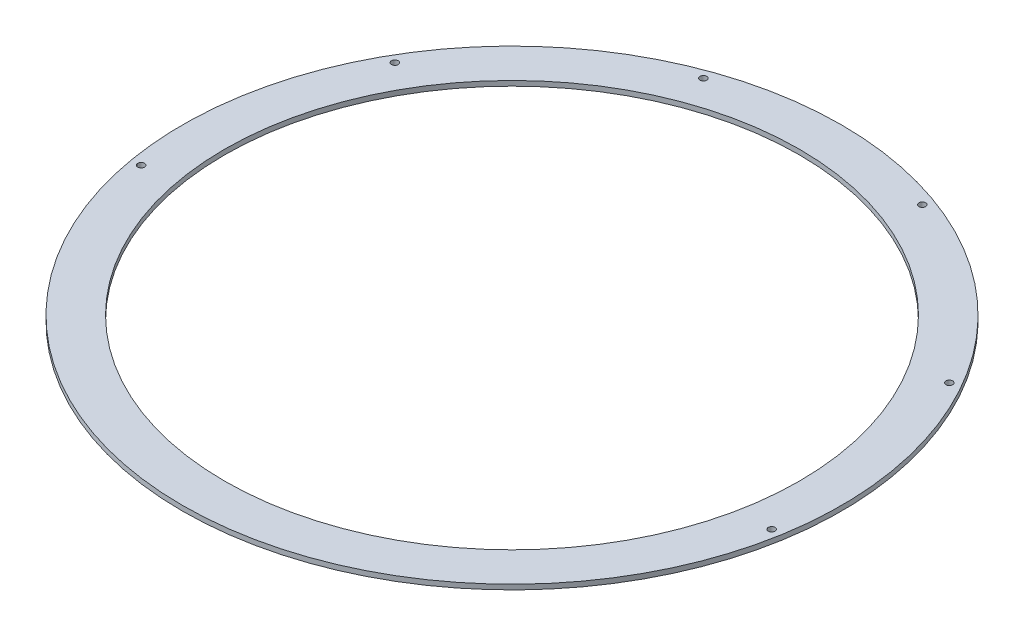
ISO-10303-21;
HEADER;
FILE_DESCRIPTION(('STEP AP214'),'2;1');
FILE_NAME('part.step','',(''),(''),'','','');
FILE_SCHEMA(('AUTOMOTIVE_DESIGN { 1 0 10303 214 1 1 1 1 }'));
ENDSEC;
DATA;
#1=APPLICATION_CONTEXT('core data for automotive mechanical design processes');
#2=APPLICATION_PROTOCOL_DEFINITION('international standard','automotive_design',2000,#1);
#3=PRODUCT_CONTEXT('',#1,'mechanical');
#4=PRODUCT('Part','Part','',(#3));
#5=PRODUCT_RELATED_PRODUCT_CATEGORY('part','',(#4));
#6=PRODUCT_DEFINITION_FORMATION('','',#4);
#7=PRODUCT_DEFINITION_CONTEXT('part definition',#1,'design');
#8=PRODUCT_DEFINITION('design','',#6,#7);
#9=PRODUCT_DEFINITION_SHAPE('','',#8);
#10=(LENGTH_UNIT() NAMED_UNIT(*) SI_UNIT(.MILLI.,.METRE.));
#11=(NAMED_UNIT(*) PLANE_ANGLE_UNIT() SI_UNIT($,.RADIAN.));
#12=(NAMED_UNIT(*) SI_UNIT($,.STERADIAN.) SOLID_ANGLE_UNIT());
#13=UNCERTAINTY_MEASURE_WITH_UNIT(LENGTH_MEASURE(1.E-05),#10,'distance_accuracy_value','');
#14=(GEOMETRIC_REPRESENTATION_CONTEXT(3) GLOBAL_UNCERTAINTY_ASSIGNED_CONTEXT((#13)) GLOBAL_UNIT_ASSIGNED_CONTEXT((#10,
#11,#12)) REPRESENTATION_CONTEXT('',''));
#15=CARTESIAN_POINT('',(0.,0.,0.));
#16=DIRECTION('',(0.,0.,1.));
#17=DIRECTION('',(1.,0.,0.));
#18=AXIS2_PLACEMENT_3D('',#15,#16,#17);
#19=CARTESIAN_POINT('',(0.,5.,0.));
#20=DIRECTION('',(0.,1.,0.));
#21=DIRECTION('',(0.,0.,1.));
#22=AXIS2_PLACEMENT_3D('',#19,#20,#21);
#23=PLANE('',#22);
#24=CARTESIAN_POINT('',(-318.092904222944,5.,56.088361386413));
#25=DIRECTION('',(0.,1.,0.));
#26=DIRECTION('',(0.,0.,1.));
#27=AXIS2_PLACEMENT_3D('',#24,#25,#26);
#28=CIRCLE('',#27,3.40000000000001);
#29=CARTESIAN_POINT('',(-318.092904222944,5.,59.488361386413));
#30=VERTEX_POINT('',#29);
#31=EDGE_CURVE('E88',#30,#30,#28,.T.);
#32=ORIENTED_EDGE('',*,*,#31,.F.);
#33=EDGE_LOOP('',(#32));
#34=FACE_BOUND('',#33,.T.);
#35=CARTESIAN_POINT('',(-279.726205422372,5.,-161.500000000003));
#36=DIRECTION('',(0.,1.,0.));
#37=DIRECTION('',(0.,0.,1.));
#38=AXIS2_PLACEMENT_3D('',#35,#36,#37);
#39=CIRCLE('',#38,3.40000000000001);
#40=CARTESIAN_POINT('',(-279.726205422372,5.,-158.100000000003));
#41=VERTEX_POINT('',#40);
#42=EDGE_CURVE('E82',#41,#41,#39,.T.);
#43=ORIENTED_EDGE('',*,*,#42,.F.);
#44=EDGE_LOOP('',(#43));
#45=FACE_BOUND('',#44,.T.);
#46=CARTESIAN_POINT('',(-110.472506294189,5.,-303.520716513849));
#47=DIRECTION('',(0.,1.,0.));
#48=DIRECTION('',(0.,0.,1.));
#49=AXIS2_PLACEMENT_3D('',#46,#47,#48);
#50=CIRCLE('',#49,3.39999999999999);
#51=CARTESIAN_POINT('',(-110.472506294189,5.,-300.120716513849));
#52=VERTEX_POINT('',#51);
#53=EDGE_CURVE('E76',#52,#52,#50,.T.);
#54=ORIENTED_EDGE('',*,*,#53,.F.);
#55=EDGE_LOOP('',(#54));
#56=FACE_BOUND('',#55,.T.);
#57=CARTESIAN_POINT('',(110.472506294189,5.,-303.520716513849));
#58=DIRECTION('',(0.,1.,0.));
#59=DIRECTION('',(0.,0.,1.));
#60=AXIS2_PLACEMENT_3D('',#57,#58,#59);
#61=CIRCLE('',#60,3.39999999999999);
#62=CARTESIAN_POINT('',(110.472506294189,5.,-300.120716513849));
#63=VERTEX_POINT('',#62);
#64=EDGE_CURVE('E70',#63,#63,#61,.T.);
#65=ORIENTED_EDGE('',*,*,#64,.F.);
#66=EDGE_LOOP('',(#65));
#67=FACE_BOUND('',#66,.T.);
#68=CARTESIAN_POINT('',(279.726205422372,5.,-161.500000000003));
#69=DIRECTION('',(0.,1.,0.));
#70=DIRECTION('',(0.,0.,1.));
#71=AXIS2_PLACEMENT_3D('',#68,#69,#70);
#72=CIRCLE('',#71,3.40000000000001);
#73=CARTESIAN_POINT('',(279.726205422372,5.,-158.100000000003));
#74=VERTEX_POINT('',#73);
#75=EDGE_CURVE('E64',#74,#74,#72,.T.);
#76=ORIENTED_EDGE('',*,*,#75,.F.);
#77=EDGE_LOOP('',(#76));
#78=FACE_BOUND('',#77,.T.);
#79=CARTESIAN_POINT('',(318.092904222944,5.,56.088361386413));
#80=DIRECTION('',(0.,1.,0.));
#81=DIRECTION('',(0.,0.,1.));
#82=AXIS2_PLACEMENT_3D('',#79,#80,#81);
#83=CIRCLE('',#82,3.40000000000001);
#84=CARTESIAN_POINT('',(318.092904222944,5.,59.488361386413));
#85=VERTEX_POINT('',#84);
#86=EDGE_CURVE('E58',#85,#85,#83,.T.);
#87=ORIENTED_EDGE('',*,*,#86,.F.);
#88=EDGE_LOOP('',(#87));
#89=FACE_BOUND('',#88,.T.);
#90=CARTESIAN_POINT('',(0.,5.,0.));
#91=DIRECTION('',(0.,1.,0.));
#92=DIRECTION('',(0.,0.,1.));
#93=AXIS2_PLACEMENT_3D('',#90,#91,#92);
#94=CIRCLE('',#93,332.5);
#95=CARTESIAN_POINT('',(0.,5.,332.5));
#96=VERTEX_POINT('',#95);
#97=EDGE_CURVE('E10',#96,#96,#94,.T.);
#98=ORIENTED_EDGE('',*,*,#97,.T.);
#99=EDGE_LOOP('',(#98));
#100=FACE_BOUND('',#99,.T.);
#101=CARTESIAN_POINT('',(0.,5.,0.));
#102=DIRECTION('',(0.,1.,0.));
#103=DIRECTION('',(0.,0.,1.));
#104=AXIS2_PLACEMENT_3D('',#101,#102,#103);
#105=CIRCLE('',#104,290.);
#106=CARTESIAN_POINT('',(0.,5.,290.));
#107=VERTEX_POINT('',#106);
#108=EDGE_CURVE('E48',#107,#107,#105,.T.);
#109=ORIENTED_EDGE('',*,*,#108,.F.);
#110=EDGE_LOOP('',(#109));
#111=FACE_BOUND('',#110,.T.);
#112=ADVANCED_FACE('F37',(#34,#45,#56,#67,#78,#89,#100,#111),#23,.T.);
#113=CARTESIAN_POINT('',(0.,0.,0.));
#114=DIRECTION('',(0.,1.,0.));
#115=DIRECTION('',(0.,0.,1.));
#116=AXIS2_PLACEMENT_3D('',#113,#114,#115);
#117=PLANE('',#116);
#118=CARTESIAN_POINT('',(-318.092904222944,0.,56.088361386413));
#119=DIRECTION('',(0.,1.,0.));
#120=DIRECTION('',(0.,0.,1.));
#121=AXIS2_PLACEMENT_3D('',#118,#119,#120);
#122=CIRCLE('',#121,3.40000000000001);
#123=CARTESIAN_POINT('',(-318.092904222944,0.,59.488361386413));
#124=VERTEX_POINT('',#123);
#125=EDGE_CURVE('E85',#124,#124,#122,.T.);
#126=ORIENTED_EDGE('',*,*,#125,.T.);
#127=EDGE_LOOP('',(#126));
#128=FACE_BOUND('',#127,.T.);
#129=CARTESIAN_POINT('',(-279.726205422372,0.,-161.500000000003));
#130=DIRECTION('',(0.,1.,0.));
#131=DIRECTION('',(0.,0.,1.));
#132=AXIS2_PLACEMENT_3D('',#129,#130,#131);
#133=CIRCLE('',#132,3.40000000000001);
#134=CARTESIAN_POINT('',(-279.726205422372,0.,-158.100000000003));
#135=VERTEX_POINT('',#134);
#136=EDGE_CURVE('E79',#135,#135,#133,.T.);
#137=ORIENTED_EDGE('',*,*,#136,.T.);
#138=EDGE_LOOP('',(#137));
#139=FACE_BOUND('',#138,.T.);
#140=CARTESIAN_POINT('',(-110.472506294189,0.,-303.520716513849));
#141=DIRECTION('',(0.,1.,0.));
#142=DIRECTION('',(0.,0.,1.));
#143=AXIS2_PLACEMENT_3D('',#140,#141,#142);
#144=CIRCLE('',#143,3.39999999999999);
#145=CARTESIAN_POINT('',(-110.472506294189,0.,-300.120716513849));
#146=VERTEX_POINT('',#145);
#147=EDGE_CURVE('E73',#146,#146,#144,.T.);
#148=ORIENTED_EDGE('',*,*,#147,.T.);
#149=EDGE_LOOP('',(#148));
#150=FACE_BOUND('',#149,.T.);
#151=CARTESIAN_POINT('',(110.472506294189,0.,-303.520716513849));
#152=DIRECTION('',(0.,1.,0.));
#153=DIRECTION('',(0.,0.,1.));
#154=AXIS2_PLACEMENT_3D('',#151,#152,#153);
#155=CIRCLE('',#154,3.39999999999999);
#156=CARTESIAN_POINT('',(110.472506294189,0.,-300.120716513849));
#157=VERTEX_POINT('',#156);
#158=EDGE_CURVE('E67',#157,#157,#155,.T.);
#159=ORIENTED_EDGE('',*,*,#158,.T.);
#160=EDGE_LOOP('',(#159));
#161=FACE_BOUND('',#160,.T.);
#162=CARTESIAN_POINT('',(279.726205422372,0.,-161.500000000003));
#163=DIRECTION('',(0.,1.,0.));
#164=DIRECTION('',(0.,0.,1.));
#165=AXIS2_PLACEMENT_3D('',#162,#163,#164);
#166=CIRCLE('',#165,3.40000000000001);
#167=CARTESIAN_POINT('',(279.726205422372,0.,-158.100000000003));
#168=VERTEX_POINT('',#167);
#169=EDGE_CURVE('E61',#168,#168,#166,.T.);
#170=ORIENTED_EDGE('',*,*,#169,.T.);
#171=EDGE_LOOP('',(#170));
#172=FACE_BOUND('',#171,.T.);
#173=CARTESIAN_POINT('',(318.092904222944,0.,56.088361386413));
#174=DIRECTION('',(0.,1.,0.));
#175=DIRECTION('',(0.,0.,1.));
#176=AXIS2_PLACEMENT_3D('',#173,#174,#175);
#177=CIRCLE('',#176,3.40000000000001);
#178=CARTESIAN_POINT('',(318.092904222944,0.,59.488361386413));
#179=VERTEX_POINT('',#178);
#180=EDGE_CURVE('E53',#179,#179,#177,.T.);
#181=ORIENTED_EDGE('',*,*,#180,.T.);
#182=EDGE_LOOP('',(#181));
#183=FACE_BOUND('',#182,.T.);
#184=CARTESIAN_POINT('',(0.,0.,0.));
#185=DIRECTION('',(0.,1.,0.));
#186=DIRECTION('',(0.,0.,1.));
#187=AXIS2_PLACEMENT_3D('',#184,#185,#186);
#188=CIRCLE('',#187,332.5);
#189=CARTESIAN_POINT('',(0.,0.,332.5));
#190=VERTEX_POINT('',#189);
#191=EDGE_CURVE('E41',#190,#190,#188,.T.);
#192=ORIENTED_EDGE('',*,*,#191,.F.);
#193=EDGE_LOOP('',(#192));
#194=FACE_BOUND('',#193,.T.);
#195=CARTESIAN_POINT('',(0.,0.,0.));
#196=DIRECTION('',(0.,1.,0.));
#197=DIRECTION('',(0.,0.,1.));
#198=AXIS2_PLACEMENT_3D('',#195,#196,#197);
#199=CIRCLE('',#198,290.);
#200=CARTESIAN_POINT('',(0.,0.,290.));
#201=VERTEX_POINT('',#200);
#202=EDGE_CURVE('E50',#201,#201,#199,.T.);
#203=ORIENTED_EDGE('',*,*,#202,.T.);
#204=EDGE_LOOP('',(#203));
#205=FACE_BOUND('',#204,.T.);
#206=ADVANCED_FACE('F96',(#128,#139,#150,#161,#172,#183,#194,#205),#117,.F.);
#207=CARTESIAN_POINT('',(0.,5.,0.));
#208=DIRECTION('',(0.,-1.,0.));
#209=DIRECTION('',(0.,0.,-1.));
#210=AXIS2_PLACEMENT_3D('',#207,#208,#209);
#211=CYLINDRICAL_SURFACE('',#210,332.5);
#212=ORIENTED_EDGE('',*,*,#97,.F.);
#213=EDGE_LOOP('',(#212));
#214=FACE_BOUND('',#213,.T.);
#215=ORIENTED_EDGE('',*,*,#191,.T.);
#216=EDGE_LOOP('',(#215));
#217=FACE_BOUND('',#216,.T.);
#218=ADVANCED_FACE('F39',(#214,#217),#211,.T.);
#219=CARTESIAN_POINT('',(0.,5.,0.));
#220=DIRECTION('',(0.,-1.,0.));
#221=DIRECTION('',(0.,0.,-1.));
#222=AXIS2_PLACEMENT_3D('',#219,#220,#221);
#223=CYLINDRICAL_SURFACE('',#222,290.);
#224=ORIENTED_EDGE('',*,*,#108,.T.);
#225=EDGE_LOOP('',(#224));
#226=FACE_BOUND('',#225,.T.);
#227=ORIENTED_EDGE('',*,*,#202,.F.);
#228=EDGE_LOOP('',(#227));
#229=FACE_BOUND('',#228,.T.);
#230=ADVANCED_FACE('F110',(#226,#229),#223,.F.);
#231=CARTESIAN_POINT('',(318.092904222944,5.,56.088361386413));
#232=DIRECTION('',(0.,1.,0.));
#233=DIRECTION('',(0.,0.,1.));
#234=AXIS2_PLACEMENT_3D('',#231,#232,#233);
#235=CYLINDRICAL_SURFACE('',#234,3.40000000000001);
#236=ORIENTED_EDGE('',*,*,#180,.F.);
#237=EDGE_LOOP('',(#236));
#238=FACE_BOUND('',#237,.T.);
#239=ORIENTED_EDGE('',*,*,#86,.T.);
#240=EDGE_LOOP('',(#239));
#241=FACE_BOUND('',#240,.T.);
#242=ADVANCED_FACE('F113',(#238,#241),#235,.F.);
#243=CARTESIAN_POINT('',(279.726205422372,5.,-161.500000000003));
#244=DIRECTION('',(0.,1.,0.));
#245=DIRECTION('',(0.,0.,1.));
#246=AXIS2_PLACEMENT_3D('',#243,#244,#245);
#247=CYLINDRICAL_SURFACE('',#246,3.40000000000001);
#248=ORIENTED_EDGE('',*,*,#169,.F.);
#249=EDGE_LOOP('',(#248));
#250=FACE_BOUND('',#249,.T.);
#251=ORIENTED_EDGE('',*,*,#75,.T.);
#252=EDGE_LOOP('',(#251));
#253=FACE_BOUND('',#252,.T.);
#254=ADVANCED_FACE('F127',(#250,#253),#247,.F.);
#255=CARTESIAN_POINT('',(110.472506294189,5.,-303.520716513849));
#256=DIRECTION('',(0.,1.,0.));
#257=DIRECTION('',(0.,0.,1.));
#258=AXIS2_PLACEMENT_3D('',#255,#256,#257);
#259=CYLINDRICAL_SURFACE('',#258,3.39999999999999);
#260=ORIENTED_EDGE('',*,*,#158,.F.);
#261=EDGE_LOOP('',(#260));
#262=FACE_BOUND('',#261,.T.);
#263=ORIENTED_EDGE('',*,*,#64,.T.);
#264=EDGE_LOOP('',(#263));
#265=FACE_BOUND('',#264,.T.);
#266=ADVANCED_FACE('F131',(#262,#265),#259,.F.);
#267=CARTESIAN_POINT('',(-110.472506294189,5.,-303.520716513849));
#268=DIRECTION('',(0.,1.,0.));
#269=DIRECTION('',(0.,0.,1.));
#270=AXIS2_PLACEMENT_3D('',#267,#268,#269);
#271=CYLINDRICAL_SURFACE('',#270,3.39999999999999);
#272=ORIENTED_EDGE('',*,*,#147,.F.);
#273=EDGE_LOOP('',(#272));
#274=FACE_BOUND('',#273,.T.);
#275=ORIENTED_EDGE('',*,*,#53,.T.);
#276=EDGE_LOOP('',(#275));
#277=FACE_BOUND('',#276,.T.);
#278=ADVANCED_FACE('F135',(#274,#277),#271,.F.);
#279=CARTESIAN_POINT('',(-279.726205422372,5.,-161.500000000003));
#280=DIRECTION('',(0.,1.,0.));
#281=DIRECTION('',(0.,0.,1.));
#282=AXIS2_PLACEMENT_3D('',#279,#280,#281);
#283=CYLINDRICAL_SURFACE('',#282,3.40000000000001);
#284=ORIENTED_EDGE('',*,*,#136,.F.);
#285=EDGE_LOOP('',(#284));
#286=FACE_BOUND('',#285,.T.);
#287=ORIENTED_EDGE('',*,*,#42,.T.);
#288=EDGE_LOOP('',(#287));
#289=FACE_BOUND('',#288,.T.);
#290=ADVANCED_FACE('F139',(#286,#289),#283,.F.);
#291=CARTESIAN_POINT('',(-318.092904222944,5.,56.088361386413));
#292=DIRECTION('',(0.,1.,0.));
#293=DIRECTION('',(0.,0.,1.));
#294=AXIS2_PLACEMENT_3D('',#291,#292,#293);
#295=CYLINDRICAL_SURFACE('',#294,3.40000000000001);
#296=ORIENTED_EDGE('',*,*,#125,.F.);
#297=EDGE_LOOP('',(#296));
#298=FACE_BOUND('',#297,.T.);
#299=ORIENTED_EDGE('',*,*,#31,.T.);
#300=EDGE_LOOP('',(#299));
#301=FACE_BOUND('',#300,.T.);
#302=ADVANCED_FACE('F92',(#298,#301),#295,.F.);
#303=CLOSED_SHELL('',(#112,#206,#218,#230,#242,#254,#266,#278,#290,#302));
#304=MANIFOLD_SOLID_BREP('B2',#303);
#305=ADVANCED_BREP_SHAPE_REPRESENTATION('',(#18,#304),#14);
#306=SHAPE_DEFINITION_REPRESENTATION(#9,#305);
ENDSEC;
END-ISO-10303-21;
